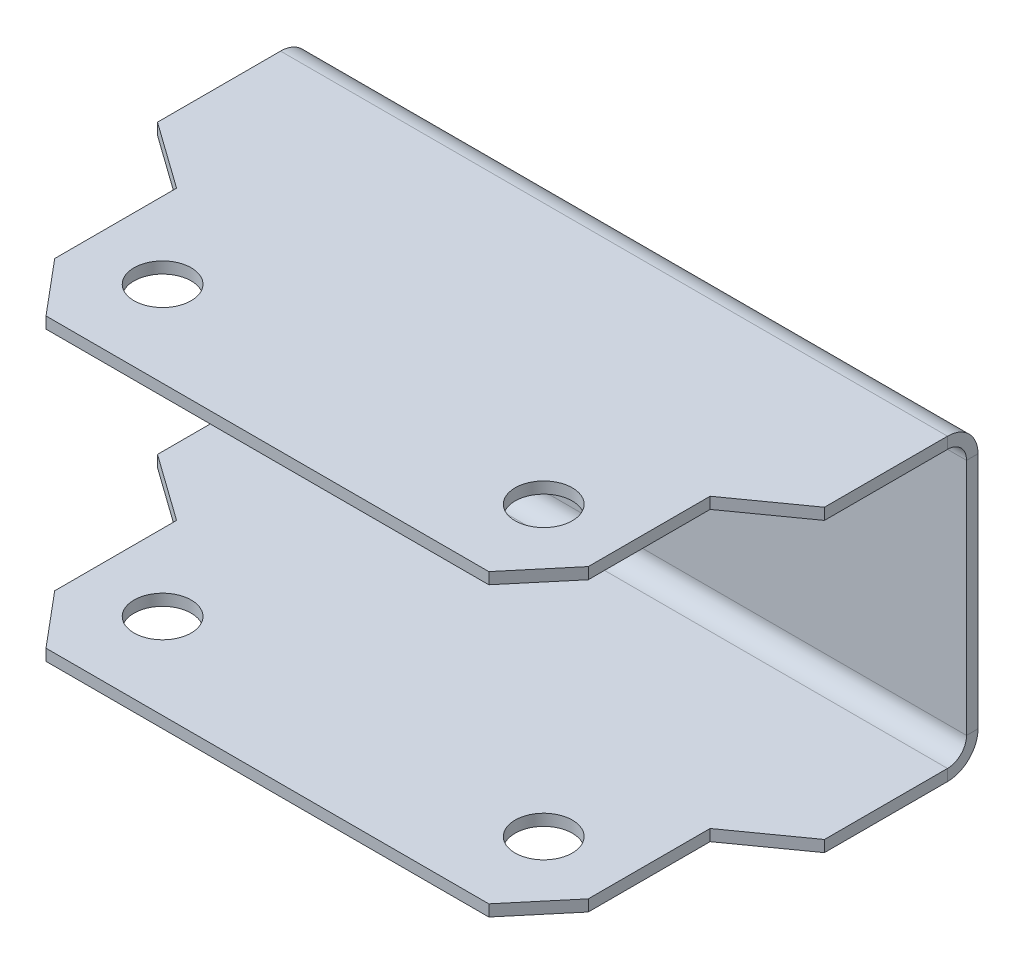
ISO-10303-21;
HEADER;
FILE_DESCRIPTION(('STEP AP214'),'2;1');
FILE_NAME('part.step','',(''),(''),'','','');
FILE_SCHEMA(('AUTOMOTIVE_DESIGN { 1 0 10303 214 1 1 1 1 }'));
ENDSEC;
DATA;
#1=APPLICATION_CONTEXT('core data for automotive mechanical design processes');
#2=APPLICATION_PROTOCOL_DEFINITION('international standard','automotive_design',2000,#1);
#3=PRODUCT_CONTEXT('',#1,'mechanical');
#4=PRODUCT('Part','Part','',(#3));
#5=PRODUCT_RELATED_PRODUCT_CATEGORY('part','',(#4));
#6=PRODUCT_DEFINITION_FORMATION('','',#4);
#7=PRODUCT_DEFINITION_CONTEXT('part definition',#1,'design');
#8=PRODUCT_DEFINITION('design','',#6,#7);
#9=PRODUCT_DEFINITION_SHAPE('','',#8);
#10=(LENGTH_UNIT() NAMED_UNIT(*) SI_UNIT(.MILLI.,.METRE.));
#11=(NAMED_UNIT(*) PLANE_ANGLE_UNIT() SI_UNIT($,.RADIAN.));
#12=(NAMED_UNIT(*) SI_UNIT($,.STERADIAN.) SOLID_ANGLE_UNIT());
#13=UNCERTAINTY_MEASURE_WITH_UNIT(LENGTH_MEASURE(1.E-05),#10,'distance_accuracy_value','');
#14=(GEOMETRIC_REPRESENTATION_CONTEXT(3) GLOBAL_UNCERTAINTY_ASSIGNED_CONTEXT((#13)) GLOBAL_UNIT_ASSIGNED_CONTEXT((#10,
#11,#12)) REPRESENTATION_CONTEXT('',''));
#15=CARTESIAN_POINT('',(0.,0.,0.));
#16=DIRECTION('',(0.,0.,1.));
#17=DIRECTION('',(1.,0.,0.));
#18=AXIS2_PLACEMENT_3D('',#15,#16,#17);
#19=CARTESIAN_POINT('',(0.,0.,-1.2));
#20=DIRECTION('',(0.,0.,1.));
#21=DIRECTION('',(1.,0.,0.));
#22=AXIS2_PLACEMENT_3D('',#19,#20,#21);
#23=PLANE('',#22);
#24=DIRECTION('',(0.,1.,0.));
#25=VECTOR('',#24,1.);
#26=CARTESIAN_POINT('',(35.,-29.5,-1.2));
#27=LINE('',#26,#25);
#28=CARTESIAN_POINT('',(35.,-12.5,-1.2));
#29=VERTEX_POINT('',#28);
#30=CARTESIAN_POINT('',(35.,12.5,-1.2));
#31=VERTEX_POINT('',#30);
#32=EDGE_CURVE('E48',#29,#31,#27,.T.);
#33=ORIENTED_EDGE('',*,*,#32,.F.);
#34=DIRECTION('',(-1.,0.,0.));
#35=VECTOR('',#34,1.);
#36=CARTESIAN_POINT('',(0.,-12.5,-1.2));
#37=LINE('',#36,#35);
#38=CARTESIAN_POINT('',(-35.,-12.5,-1.2));
#39=VERTEX_POINT('',#38);
#40=EDGE_CURVE('E370',#29,#39,#37,.T.);
#41=ORIENTED_EDGE('',*,*,#40,.T.);
#42=DIRECTION('',(0.,-1.,0.));
#43=VECTOR('',#42,1.);
#44=CARTESIAN_POINT('',(-35.,-29.5,-1.2));
#45=LINE('',#44,#43);
#46=CARTESIAN_POINT('',(-35.,12.5,-1.2));
#47=VERTEX_POINT('',#46);
#48=EDGE_CURVE('E378',#47,#39,#45,.T.);
#49=ORIENTED_EDGE('',*,*,#48,.F.);
#50=DIRECTION('',(-1.,0.,0.));
#51=VECTOR('',#50,1.);
#52=CARTESIAN_POINT('',(0.,12.5,-1.2));
#53=LINE('',#52,#51);
#54=EDGE_CURVE('E361',#31,#47,#53,.T.);
#55=ORIENTED_EDGE('',*,*,#54,.F.);
#56=EDGE_LOOP('',(#33,#41,#49,#55));
#57=FACE_BOUND('',#56,.T.);
#58=ADVANCED_FACE('F44',(#57),#23,.F.);
#59=CARTESIAN_POINT('',(0.,0.,0.));
#60=DIRECTION('',(0.,0.,1.));
#61=DIRECTION('',(1.,0.,0.));
#62=AXIS2_PLACEMENT_3D('',#59,#60,#61);
#63=PLANE('',#62);
#64=DIRECTION('',(-1.,0.,0.));
#65=VECTOR('',#64,1.);
#66=CARTESIAN_POINT('',(0.,-12.5,0.));
#67=LINE('',#66,#65);
#68=CARTESIAN_POINT('',(35.,-12.5,0.));
#69=VERTEX_POINT('',#68);
#70=CARTESIAN_POINT('',(-35.,-12.5,0.));
#71=VERTEX_POINT('',#70);
#72=EDGE_CURVE('E53',#69,#71,#67,.T.);
#73=ORIENTED_EDGE('',*,*,#72,.F.);
#74=DIRECTION('',(0.,1.,0.));
#75=VECTOR('',#74,1.);
#76=CARTESIAN_POINT('',(35.,-29.5,0.));
#77=LINE('',#76,#75);
#78=CARTESIAN_POINT('',(35.,12.5,0.));
#79=VERTEX_POINT('',#78);
#80=EDGE_CURVE('E69',#69,#79,#77,.T.);
#81=ORIENTED_EDGE('',*,*,#80,.T.);
#82=DIRECTION('',(-1.,0.,0.));
#83=VECTOR('',#82,1.);
#84=CARTESIAN_POINT('',(0.,12.5,0.));
#85=LINE('',#84,#83);
#86=CARTESIAN_POINT('',(-35.,12.5,0.));
#87=VERTEX_POINT('',#86);
#88=EDGE_CURVE('E366',#79,#87,#85,.T.);
#89=ORIENTED_EDGE('',*,*,#88,.T.);
#90=DIRECTION('',(0.,-1.,0.));
#91=VECTOR('',#90,1.);
#92=CARTESIAN_POINT('',(-35.,-29.5,0.));
#93=LINE('',#92,#91);
#94=EDGE_CURVE('E61',#87,#71,#93,.T.);
#95=ORIENTED_EDGE('',*,*,#94,.T.);
#96=EDGE_LOOP('',(#73,#81,#89,#95));
#97=FACE_BOUND('',#96,.T.);
#98=ADVANCED_FACE('F380',(#97),#63,.T.);
#99=CARTESIAN_POINT('',(-35.,-29.5,-1.2));
#100=DIRECTION('',(-1.,0.,0.));
#101=DIRECTION('',(0.,0.,1.));
#102=AXIS2_PLACEMENT_3D('',#99,#100,#101);
#103=PLANE('',#102);
#104=DIRECTION('',(0.,0.,-1.));
#105=VECTOR('',#104,1.);
#106=CARTESIAN_POINT('',(-35.,-12.5,-1.19999999999988));
#107=LINE('',#106,#105);
#108=EDGE_CURVE('E12',#71,#39,#107,.T.);
#109=ORIENTED_EDGE('',*,*,#108,.F.);
#110=ORIENTED_EDGE('',*,*,#94,.F.);
#111=DIRECTION('',(0.,0.,-1.));
#112=VECTOR('',#111,1.);
#113=CARTESIAN_POINT('',(-35.,12.5,-1.19999999999971));
#114=LINE('',#113,#112);
#115=EDGE_CURVE('E363',#87,#47,#114,.T.);
#116=ORIENTED_EDGE('',*,*,#115,.T.);
#117=ORIENTED_EDGE('',*,*,#48,.T.);
#118=EDGE_LOOP('',(#109,#110,#116,#117));
#119=FACE_BOUND('',#118,.T.);
#120=ADVANCED_FACE('F46',(#119),#103,.T.);
#121=CARTESIAN_POINT('',(35.,-29.5,-1.2));
#122=DIRECTION('',(1.,0.,0.));
#123=DIRECTION('',(0.,0.,-1.));
#124=AXIS2_PLACEMENT_3D('',#121,#122,#123);
#125=PLANE('',#124);
#126=DIRECTION('',(0.,0.,1.));
#127=VECTOR('',#126,1.);
#128=CARTESIAN_POINT('',(35.,-12.5,-1.19999999999988));
#129=LINE('',#128,#127);
#130=EDGE_CURVE('E373',#29,#69,#129,.T.);
#131=ORIENTED_EDGE('',*,*,#130,.F.);
#132=ORIENTED_EDGE('',*,*,#32,.T.);
#133=DIRECTION('',(0.,0.,1.));
#134=VECTOR('',#133,1.);
#135=CARTESIAN_POINT('',(35.,12.5,-1.19999999999971));
#136=LINE('',#135,#134);
#137=EDGE_CURVE('E368',#31,#79,#136,.T.);
#138=ORIENTED_EDGE('',*,*,#137,.T.);
#139=ORIENTED_EDGE('',*,*,#80,.F.);
#140=EDGE_LOOP('',(#131,#132,#138,#139));
#141=FACE_BOUND('',#140,.T.);
#142=ADVANCED_FACE('F383',(#141),#125,.T.);
#143=CARTESIAN_POINT('',(35.,12.5,2.));
#144=DIRECTION('',(1.,0.,0.));
#145=DIRECTION('',(0.,0.,-1.));
#146=AXIS2_PLACEMENT_3D('',#143,#144,#145);
#147=PLANE('',#146);
#148=DIRECTION('',(0.,-1.,0.));
#149=VECTOR('',#148,1.);
#150=CARTESIAN_POINT('',(35.,15.6999999999997,2.00000000000001));
#151=LINE('',#150,#149);
#152=CARTESIAN_POINT('',(35.,15.7,2.00000000000002));
#153=VERTEX_POINT('',#152);
#154=CARTESIAN_POINT('',(35.,14.5,2.));
#155=VERTEX_POINT('',#154);
#156=EDGE_CURVE('E255',#153,#155,#151,.T.);
#157=ORIENTED_EDGE('',*,*,#156,.T.);
#158=CARTESIAN_POINT('',(35.,12.5,2.));
#159=DIRECTION('',(1.,0.,0.));
#160=DIRECTION('',(0.,0.,-1.));
#161=AXIS2_PLACEMENT_3D('',#158,#159,#160);
#162=CIRCLE('',#161,2.);
#163=EDGE_CURVE('E263',#155,#79,#162,.F.);
#164=ORIENTED_EDGE('',*,*,#163,.T.);
#165=ORIENTED_EDGE('',*,*,#137,.F.);
#166=CARTESIAN_POINT('',(35.,12.5,2.));
#167=DIRECTION('',(-1.,0.,0.));
#168=DIRECTION('',(0.,0.,-1.));
#169=AXIS2_PLACEMENT_3D('',#166,#167,#168);
#170=CIRCLE('',#169,3.2);
#171=EDGE_CURVE('E351',#153,#31,#170,.T.);
#172=ORIENTED_EDGE('',*,*,#171,.F.);
#173=EDGE_LOOP('',(#157,#164,#165,#172));
#174=FACE_BOUND('',#173,.T.);
#175=ADVANCED_FACE('F387',(#174),#147,.T.);
#176=CARTESIAN_POINT('',(-35.,12.5,2.));
#177=DIRECTION('',(-1.,0.,0.));
#178=DIRECTION('',(0.,0.,1.));
#179=AXIS2_PLACEMENT_3D('',#176,#177,#178);
#180=PLANE('',#179);
#181=CARTESIAN_POINT('',(-35.,12.5,2.));
#182=DIRECTION('',(1.,0.,0.));
#183=DIRECTION('',(0.,0.,-1.));
#184=AXIS2_PLACEMENT_3D('',#181,#182,#183);
#185=CIRCLE('',#184,2.);
#186=CARTESIAN_POINT('',(-35.,14.5,2.));
#187=VERTEX_POINT('',#186);
#188=EDGE_CURVE('E355',#87,#187,#185,.T.);
#189=ORIENTED_EDGE('',*,*,#188,.T.);
#190=DIRECTION('',(0.,1.,0.));
#191=VECTOR('',#190,1.);
#192=CARTESIAN_POINT('',(-35.,15.6999999999997,2.00000000000001));
#193=LINE('',#192,#191);
#194=CARTESIAN_POINT('',(-35.,15.7,2.00000000000001));
#195=VERTEX_POINT('',#194);
#196=EDGE_CURVE('E343',#187,#195,#193,.T.);
#197=ORIENTED_EDGE('',*,*,#196,.T.);
#198=CARTESIAN_POINT('',(-35.,12.5,2.));
#199=DIRECTION('',(1.,0.,0.));
#200=DIRECTION('',(0.,0.,1.));
#201=AXIS2_PLACEMENT_3D('',#198,#199,#200);
#202=CIRCLE('',#201,3.2);
#203=EDGE_CURVE('E354',#47,#195,#202,.T.);
#204=ORIENTED_EDGE('',*,*,#203,.F.);
#205=ORIENTED_EDGE('',*,*,#115,.F.);
#206=EDGE_LOOP('',(#189,#197,#204,#205));
#207=FACE_BOUND('',#206,.T.);
#208=ADVANCED_FACE('F404',(#207),#180,.T.);
#209=CARTESIAN_POINT('',(-70.1293065090326,12.5,2.));
#210=DIRECTION('',(1.,0.,0.));
#211=DIRECTION('',(0.,0.,-1.));
#212=AXIS2_PLACEMENT_3D('',#209,#210,#211);
#213=CYLINDRICAL_SURFACE('',#212,3.2);
#214=ORIENTED_EDGE('',*,*,#54,.T.);
#215=ORIENTED_EDGE('',*,*,#203,.T.);
#216=DIRECTION('',(-1.,0.,0.));
#217=VECTOR('',#216,1.);
#218=CARTESIAN_POINT('',(0.,15.7,2.00000000000001));
#219=LINE('',#218,#217);
#220=EDGE_CURVE('E294',#153,#195,#219,.T.);
#221=ORIENTED_EDGE('',*,*,#220,.F.);
#222=ORIENTED_EDGE('',*,*,#171,.T.);
#223=EDGE_LOOP('',(#214,#215,#221,#222));
#224=FACE_BOUND('',#223,.T.);
#225=ADVANCED_FACE('F391',(#224),#213,.T.);
#226=CARTESIAN_POINT('',(-70.1293065090326,12.5,2.));
#227=DIRECTION('',(1.,0.,0.));
#228=DIRECTION('',(0.,0.,-1.));
#229=AXIS2_PLACEMENT_3D('',#226,#227,#228);
#230=CYLINDRICAL_SURFACE('',#229,2.);
#231=ORIENTED_EDGE('',*,*,#88,.F.);
#232=ORIENTED_EDGE('',*,*,#163,.F.);
#233=DIRECTION('',(-1.,0.,0.));
#234=VECTOR('',#233,1.);
#235=CARTESIAN_POINT('',(0.,14.5,2.));
#236=LINE('',#235,#234);
#237=EDGE_CURVE('E346',#155,#187,#236,.T.);
#238=ORIENTED_EDGE('',*,*,#237,.T.);
#239=ORIENTED_EDGE('',*,*,#188,.F.);
#240=EDGE_LOOP('',(#231,#232,#238,#239));
#241=FACE_BOUND('',#240,.T.);
#242=ADVANCED_FACE('F408',(#241),#230,.F.);
#243=CARTESIAN_POINT('',(35.,15.7,14.9159295503333));
#244=DIRECTION('',(0.581116537312831,0.,0.813820354907362));
#245=DIRECTION('',(-0.813820354907363,0.,0.581116537312831));
#246=AXIS2_PLACEMENT_3D('',#243,#244,#245);
#247=PLANE('',#246);
#248=DIRECTION('',(-0.813820354907362,0.,0.581116537312831));
#249=VECTOR('',#248,1.);
#250=CARTESIAN_POINT('',(35.,14.5,14.9159295503333));
#251=LINE('',#250,#249);
#252=CARTESIAN_POINT('',(35.,14.5,14.9159295503333));
#253=VERTEX_POINT('',#252);
#254=CARTESIAN_POINT('',(28.,14.5,19.9143493326117));
#255=VERTEX_POINT('',#254);
#256=EDGE_CURVE('E286',#253,#255,#251,.T.);
#257=ORIENTED_EDGE('',*,*,#256,.F.);
#258=DIRECTION('',(0.,-1.,0.));
#259=VECTOR('',#258,1.);
#260=CARTESIAN_POINT('',(35.,15.7,14.9159295503333));
#261=LINE('',#260,#259);
#262=CARTESIAN_POINT('',(35.,15.7,14.9159295503333));
#263=VERTEX_POINT('',#262);
#264=EDGE_CURVE('E260',#263,#253,#261,.T.);
#265=ORIENTED_EDGE('',*,*,#264,.F.);
#266=DIRECTION('',(-0.813820354907362,0.,0.581116537312831));
#267=VECTOR('',#266,1.);
#268=CARTESIAN_POINT('',(35.,15.7,14.9159295503333));
#269=LINE('',#268,#267);
#270=CARTESIAN_POINT('',(28.,15.6999999999999,19.9143493326117));
#271=VERTEX_POINT('',#270);
#272=EDGE_CURVE('E340',#263,#271,#269,.T.);
#273=ORIENTED_EDGE('',*,*,#272,.T.);
#274=DIRECTION('',(0.,-1.,0.));
#275=VECTOR('',#274,1.);
#276=CARTESIAN_POINT('',(28.,15.6999999999999,19.9143493326117));
#277=LINE('',#276,#275);
#278=EDGE_CURVE('E338',#271,#255,#277,.T.);
#279=ORIENTED_EDGE('',*,*,#278,.T.);
#280=EDGE_LOOP('',(#257,#265,#273,#279));
#281=FACE_BOUND('',#280,.T.);
#282=ADVANCED_FACE('F488',(#281),#247,.T.);
#283=CARTESIAN_POINT('',(28.,15.6999999999999,19.9143493326117));
#284=DIRECTION('',(1.,0.,0.));
#285=DIRECTION('',(0.,1.,0.));
#286=AXIS2_PLACEMENT_3D('',#283,#284,#285);
#287=PLANE('',#286);
#288=DIRECTION('',(0.,0.,1.));
#289=VECTOR('',#288,1.);
#290=CARTESIAN_POINT('',(28.,14.5,19.9143493326117));
#291=LINE('',#290,#289);
#292=CARTESIAN_POINT('',(28.,14.4999999999999,32.7050010724791));
#293=VERTEX_POINT('',#292);
#294=EDGE_CURVE('E283',#255,#293,#291,.T.);
#295=ORIENTED_EDGE('',*,*,#294,.F.);
#296=ORIENTED_EDGE('',*,*,#278,.F.);
#297=DIRECTION('',(0.,0.,1.));
#298=VECTOR('',#297,1.);
#299=CARTESIAN_POINT('',(28.,15.6999999999999,19.9143493326117));
#300=LINE('',#299,#298);
#301=CARTESIAN_POINT('',(28.,15.6999999999999,32.7050010724791));
#302=VERTEX_POINT('',#301);
#303=EDGE_CURVE('E335',#271,#302,#300,.T.);
#304=ORIENTED_EDGE('',*,*,#303,.T.);
#305=DIRECTION('',(0.,-1.,0.));
#306=VECTOR('',#305,1.);
#307=CARTESIAN_POINT('',(28.,15.6999999999999,32.7050010724791));
#308=LINE('',#307,#306);
#309=EDGE_CURVE('E333',#302,#293,#308,.T.);
#310=ORIENTED_EDGE('',*,*,#309,.T.);
#311=EDGE_LOOP('',(#295,#296,#304,#310));
#312=FACE_BOUND('',#311,.T.);
#313=ADVANCED_FACE('F497',(#312),#287,.T.);
#314=CARTESIAN_POINT('',(28.,15.6999999999999,32.7050010724791));
#315=DIRECTION('',(0.766044443118979,0.,0.642787609686538));
#316=DIRECTION('',(-0.642787609686538,0.,0.766044443118979));
#317=AXIS2_PLACEMENT_3D('',#314,#315,#316);
#318=PLANE('',#317);
#319=DIRECTION('',(-0.642787609686538,0.,0.766044443118979));
#320=VECTOR('',#319,1.);
#321=CARTESIAN_POINT('',(28.,14.4999999999999,32.7050010724791));
#322=LINE('',#321,#320);
#323=CARTESIAN_POINT('',(23.238290905672,14.4999999999999,38.3797849925331));
#324=VERTEX_POINT('',#323);
#325=EDGE_CURVE('E280',#293,#324,#322,.T.);
#326=ORIENTED_EDGE('',*,*,#325,.F.);
#327=ORIENTED_EDGE('',*,*,#309,.F.);
#328=DIRECTION('',(-0.642787609686538,0.,0.766044443118979));
#329=VECTOR('',#328,1.);
#330=CARTESIAN_POINT('',(28.,15.6999999999999,32.7050010724791));
#331=LINE('',#330,#329);
#332=CARTESIAN_POINT('',(23.238290905672,15.6999999999999,38.3797849925331));
#333=VERTEX_POINT('',#332);
#334=EDGE_CURVE('E330',#302,#333,#331,.T.);
#335=ORIENTED_EDGE('',*,*,#334,.T.);
#336=DIRECTION('',(0.,-1.,0.));
#337=VECTOR('',#336,1.);
#338=CARTESIAN_POINT('',(23.238290905672,15.6999999999999,38.3797849925331));
#339=LINE('',#338,#337);
#340=EDGE_CURVE('E328',#333,#324,#339,.T.);
#341=ORIENTED_EDGE('',*,*,#340,.T.);
#342=EDGE_LOOP('',(#326,#327,#335,#341));
#343=FACE_BOUND('',#342,.T.);
#344=ADVANCED_FACE('F507',(#343),#318,.T.);
#345=CARTESIAN_POINT('',(23.238290905672,15.6999999999999,38.3797849925331));
#346=DIRECTION('',(0.,0.,1.));
#347=DIRECTION('',(-1.,0.,0.));
#348=AXIS2_PLACEMENT_3D('',#345,#346,#347);
#349=PLANE('',#348);
#350=DIRECTION('',(-1.,0.,0.));
#351=VECTOR('',#350,1.);
#352=CARTESIAN_POINT('',(23.238290905672,14.4999999999999,38.3797849925331));
#353=LINE('',#352,#351);
#354=CARTESIAN_POINT('',(-23.238290905672,14.4999999999999,38.3797849925331));
#355=VERTEX_POINT('',#354);
#356=EDGE_CURVE('E277',#324,#355,#353,.T.);
#357=ORIENTED_EDGE('',*,*,#356,.F.);
#358=ORIENTED_EDGE('',*,*,#340,.F.);
#359=DIRECTION('',(-1.,0.,0.));
#360=VECTOR('',#359,1.);
#361=CARTESIAN_POINT('',(23.238290905672,15.6999999999999,38.3797849925331));
#362=LINE('',#361,#360);
#363=CARTESIAN_POINT('',(-23.238290905672,15.6999999999999,38.3797849925331));
#364=VERTEX_POINT('',#363);
#365=EDGE_CURVE('E325',#333,#364,#362,.T.);
#366=ORIENTED_EDGE('',*,*,#365,.T.);
#367=DIRECTION('',(0.,-1.,0.));
#368=VECTOR('',#367,1.);
#369=CARTESIAN_POINT('',(-23.238290905672,15.6999999999999,38.3797849925331));
#370=LINE('',#369,#368);
#371=EDGE_CURVE('E323',#364,#355,#370,.T.);
#372=ORIENTED_EDGE('',*,*,#371,.T.);
#373=EDGE_LOOP('',(#357,#358,#366,#372));
#374=FACE_BOUND('',#373,.T.);
#375=ADVANCED_FACE('F517',(#374),#349,.T.);
#376=CARTESIAN_POINT('',(-28.,15.6999999999999,32.7050010724791));
#377=DIRECTION('',(-0.766044443118979,0.,0.642787609686538));
#378=DIRECTION('',(-0.642787609686538,0.,-0.766044443118979));
#379=AXIS2_PLACEMENT_3D('',#376,#377,#378);
#380=PLANE('',#379);
#381=DIRECTION('',(-0.642787609686538,0.,-0.766044443118979));
#382=VECTOR('',#381,1.);
#383=CARTESIAN_POINT('',(-28.,14.4999999999999,32.7050010724791));
#384=LINE('',#383,#382);
#385=CARTESIAN_POINT('',(-28.,14.4999999999999,32.7050010724791));
#386=VERTEX_POINT('',#385);
#387=EDGE_CURVE('E274',#355,#386,#384,.T.);
#388=ORIENTED_EDGE('',*,*,#387,.F.);
#389=ORIENTED_EDGE('',*,*,#371,.F.);
#390=DIRECTION('',(-0.642787609686538,0.,-0.766044443118979));
#391=VECTOR('',#390,1.);
#392=CARTESIAN_POINT('',(-28.,15.6999999999999,32.7050010724791));
#393=LINE('',#392,#391);
#394=CARTESIAN_POINT('',(-28.,15.6999999999999,32.7050010724791));
#395=VERTEX_POINT('',#394);
#396=EDGE_CURVE('E320',#364,#395,#393,.T.);
#397=ORIENTED_EDGE('',*,*,#396,.T.);
#398=DIRECTION('',(0.,-1.,0.));
#399=VECTOR('',#398,1.);
#400=CARTESIAN_POINT('',(-28.,15.6999999999999,32.7050010724791));
#401=LINE('',#400,#399);
#402=EDGE_CURVE('E318',#395,#386,#401,.T.);
#403=ORIENTED_EDGE('',*,*,#402,.T.);
#404=EDGE_LOOP('',(#388,#389,#397,#403));
#405=FACE_BOUND('',#404,.T.);
#406=ADVANCED_FACE('F527',(#405),#380,.T.);
#407=CARTESIAN_POINT('',(-28.,15.6999999999999,19.9143493326117));
#408=DIRECTION('',(-1.,0.,0.));
#409=DIRECTION('',(0.,-1.,0.));
#410=AXIS2_PLACEMENT_3D('',#407,#408,#409);
#411=PLANE('',#410);
#412=DIRECTION('',(0.,0.,-1.));
#413=VECTOR('',#412,1.);
#414=CARTESIAN_POINT('',(-28.,14.5,19.9143493326117));
#415=LINE('',#414,#413);
#416=CARTESIAN_POINT('',(-28.,14.5,19.9143493326117));
#417=VERTEX_POINT('',#416);
#418=EDGE_CURVE('E271',#386,#417,#415,.T.);
#419=ORIENTED_EDGE('',*,*,#418,.F.);
#420=ORIENTED_EDGE('',*,*,#402,.F.);
#421=DIRECTION('',(0.,0.,-1.));
#422=VECTOR('',#421,1.);
#423=CARTESIAN_POINT('',(-28.,15.6999999999999,19.9143493326117));
#424=LINE('',#423,#422);
#425=CARTESIAN_POINT('',(-28.,15.6999999999999,19.9143493326117));
#426=VERTEX_POINT('',#425);
#427=EDGE_CURVE('E315',#395,#426,#424,.T.);
#428=ORIENTED_EDGE('',*,*,#427,.T.);
#429=DIRECTION('',(0.,-1.,0.));
#430=VECTOR('',#429,1.);
#431=CARTESIAN_POINT('',(-28.,15.6999999999999,19.9143493326117));
#432=LINE('',#431,#430);
#433=EDGE_CURVE('E313',#426,#417,#432,.T.);
#434=ORIENTED_EDGE('',*,*,#433,.T.);
#435=EDGE_LOOP('',(#419,#420,#428,#434));
#436=FACE_BOUND('',#435,.T.);
#437=ADVANCED_FACE('F537',(#436),#411,.T.);
#438=CARTESIAN_POINT('',(-35.,15.7,14.9159295503333));
#439=DIRECTION('',(-0.58111653731283,0.,0.813820354907363));
#440=DIRECTION('',(-0.813820354907363,0.,-0.58111653731283));
#441=AXIS2_PLACEMENT_3D('',#438,#439,#440);
#442=PLANE('',#441);
#443=DIRECTION('',(-0.813820354907363,0.,-0.58111653731283));
#444=VECTOR('',#443,1.);
#445=CARTESIAN_POINT('',(-35.,14.5,14.9159295503333));
#446=LINE('',#445,#444);
#447=CARTESIAN_POINT('',(-35.,14.5,14.9159295503333));
#448=VERTEX_POINT('',#447);
#449=EDGE_CURVE('E268',#417,#448,#446,.T.);
#450=ORIENTED_EDGE('',*,*,#449,.F.);
#451=ORIENTED_EDGE('',*,*,#433,.F.);
#452=DIRECTION('',(-0.813820354907363,0.,-0.58111653731283));
#453=VECTOR('',#452,1.);
#454=CARTESIAN_POINT('',(-35.,15.7,14.9159295503333));
#455=LINE('',#454,#453);
#456=CARTESIAN_POINT('',(-35.,15.7,14.9159295503333));
#457=VERTEX_POINT('',#456);
#458=EDGE_CURVE('E310',#426,#457,#455,.T.);
#459=ORIENTED_EDGE('',*,*,#458,.T.);
#460=DIRECTION('',(0.,-1.,0.));
#461=VECTOR('',#460,1.);
#462=CARTESIAN_POINT('',(-35.,15.7,14.9159295503333));
#463=LINE('',#462,#461);
#464=EDGE_CURVE('E308',#457,#448,#463,.T.);
#465=ORIENTED_EDGE('',*,*,#464,.T.);
#466=EDGE_LOOP('',(#450,#451,#459,#465));
#467=FACE_BOUND('',#466,.T.);
#468=ADVANCED_FACE('F547',(#467),#442,.T.);
#469=CARTESIAN_POINT('',(-20.,15.6999999999999,29.3797849925331));
#470=DIRECTION('',(0.,-1.,0.));
#471=DIRECTION('',(1.,0.,0.));
#472=AXIS2_PLACEMENT_3D('',#469,#470,#471);
#473=CYLINDRICAL_SURFACE('',#472,3.);
#474=CARTESIAN_POINT('',(-20.,15.6999999999999,29.3797849925331));
#475=DIRECTION('',(0.,-1.,0.));
#476=DIRECTION('',(1.,0.,0.));
#477=AXIS2_PLACEMENT_3D('',#474,#475,#476);
#478=CIRCLE('',#477,3.);
#479=CARTESIAN_POINT('',(-17.,15.6999999999999,29.3797849925331));
#480=VERTEX_POINT('',#479);
#481=EDGE_CURVE('E296',#480,#480,#478,.T.);
#482=ORIENTED_EDGE('',*,*,#481,.F.);
#483=EDGE_LOOP('',(#482));
#484=FACE_BOUND('',#483,.T.);
#485=CARTESIAN_POINT('',(-20.,14.4999999999999,29.3797849925331));
#486=DIRECTION('',(0.,-1.,0.));
#487=DIRECTION('',(1.,0.,0.));
#488=AXIS2_PLACEMENT_3D('',#485,#486,#487);
#489=CIRCLE('',#488,3.);
#490=CARTESIAN_POINT('',(-17.,14.4999999999999,29.3797849925331));
#491=VERTEX_POINT('',#490);
#492=EDGE_CURVE('E305',#491,#491,#489,.T.);
#493=ORIENTED_EDGE('',*,*,#492,.T.);
#494=EDGE_LOOP('',(#493));
#495=FACE_BOUND('',#494,.T.);
#496=ADVANCED_FACE('F557',(#484,#495),#473,.F.);
#497=CARTESIAN_POINT('',(20.,15.6999999999999,29.3797849925331));
#498=DIRECTION('',(0.,-1.,0.));
#499=DIRECTION('',(1.,0.,0.));
#500=AXIS2_PLACEMENT_3D('',#497,#498,#499);
#501=CYLINDRICAL_SURFACE('',#500,3.);
#502=CARTESIAN_POINT('',(20.,15.6999999999999,29.3797849925331));
#503=DIRECTION('',(0.,-1.,0.));
#504=DIRECTION('',(-1.,0.,0.));
#505=AXIS2_PLACEMENT_3D('',#502,#503,#504);
#506=CIRCLE('',#505,3.);
#507=CARTESIAN_POINT('',(17.,15.6999999999999,29.3797849925331));
#508=VERTEX_POINT('',#507);
#509=EDGE_CURVE('E299',#508,#508,#506,.T.);
#510=ORIENTED_EDGE('',*,*,#509,.F.);
#511=EDGE_LOOP('',(#510));
#512=FACE_BOUND('',#511,.T.);
#513=CARTESIAN_POINT('',(20.,14.4999999999999,29.3797849925331));
#514=DIRECTION('',(0.,-1.,0.));
#515=DIRECTION('',(-1.,0.,0.));
#516=AXIS2_PLACEMENT_3D('',#513,#514,#515);
#517=CIRCLE('',#516,3.);
#518=CARTESIAN_POINT('',(17.,14.4999999999999,29.3797849925331));
#519=VERTEX_POINT('',#518);
#520=EDGE_CURVE('E302',#519,#519,#517,.T.);
#521=ORIENTED_EDGE('',*,*,#520,.T.);
#522=EDGE_LOOP('',(#521));
#523=FACE_BOUND('',#522,.T.);
#524=ADVANCED_FACE('F567',(#512,#523),#501,.F.);
#525=CARTESIAN_POINT('',(0.,15.7000000000001,-14.5840704496667));
#526=DIRECTION('',(0.,-1.,0.));
#527=DIRECTION('',(1.,0.,0.));
#528=AXIS2_PLACEMENT_3D('',#525,#526,#527);
#529=PLANE('',#528);
#530=ORIENTED_EDGE('',*,*,#509,.T.);
#531=EDGE_LOOP('',(#530));
#532=FACE_BOUND('',#531,.T.);
#533=ORIENTED_EDGE('',*,*,#481,.T.);
#534=EDGE_LOOP('',(#533));
#535=FACE_BOUND('',#534,.T.);
#536=DIRECTION('',(0.,0.,1.));
#537=VECTOR('',#536,1.);
#538=CARTESIAN_POINT('',(35.,15.7000000000002,-44.0840704496667));
#539=LINE('',#538,#537);
#540=EDGE_CURVE('E264',#153,#263,#539,.T.);
#541=ORIENTED_EDGE('',*,*,#540,.F.);
#542=ORIENTED_EDGE('',*,*,#220,.T.);
#543=DIRECTION('',(0.,0.,-1.));
#544=VECTOR('',#543,1.);
#545=CARTESIAN_POINT('',(-35.,15.7000000000002,-44.0840704496667));
#546=LINE('',#545,#544);
#547=EDGE_CURVE('E291',#457,#195,#546,.T.);
#548=ORIENTED_EDGE('',*,*,#547,.F.);
#549=ORIENTED_EDGE('',*,*,#458,.F.);
#550=ORIENTED_EDGE('',*,*,#427,.F.);
#551=ORIENTED_EDGE('',*,*,#396,.F.);
#552=ORIENTED_EDGE('',*,*,#365,.F.);
#553=ORIENTED_EDGE('',*,*,#334,.F.);
#554=ORIENTED_EDGE('',*,*,#303,.F.);
#555=ORIENTED_EDGE('',*,*,#272,.F.);
#556=EDGE_LOOP('',(#541,#542,#548,#549,#550,#551,#552,#553,#554,#555));
#557=FACE_BOUND('',#556,.T.);
#558=ADVANCED_FACE('F396',(#532,#535,#557),#529,.F.);
#559=CARTESIAN_POINT('',(-35.,15.7000000000002,-44.0840704496667));
#560=DIRECTION('',(-1.,0.,0.));
#561=DIRECTION('',(0.,-1.,0.));
#562=AXIS2_PLACEMENT_3D('',#559,#560,#561);
#563=PLANE('',#562);
#564=ORIENTED_EDGE('',*,*,#196,.F.);
#565=DIRECTION('',(0.,0.,-1.));
#566=VECTOR('',#565,1.);
#567=CARTESIAN_POINT('',(-35.,14.5000000000002,-44.0840704496667));
#568=LINE('',#567,#566);
#569=EDGE_CURVE('E266',#448,#187,#568,.T.);
#570=ORIENTED_EDGE('',*,*,#569,.F.);
#571=ORIENTED_EDGE('',*,*,#464,.F.);
#572=ORIENTED_EDGE('',*,*,#547,.T.);
#573=EDGE_LOOP('',(#564,#570,#571,#572));
#574=FACE_BOUND('',#573,.T.);
#575=ADVANCED_FACE('F401',(#574),#563,.T.);
#576=CARTESIAN_POINT('',(0.,14.5000000000001,-14.5840704496667));
#577=DIRECTION('',(0.,-1.,0.));
#578=DIRECTION('',(1.,0.,0.));
#579=AXIS2_PLACEMENT_3D('',#576,#577,#578);
#580=PLANE('',#579);
#581=ORIENTED_EDGE('',*,*,#237,.F.);
#582=DIRECTION('',(0.,0.,1.));
#583=VECTOR('',#582,1.);
#584=CARTESIAN_POINT('',(35.,14.5000000000002,-44.0840704496667));
#585=LINE('',#584,#583);
#586=EDGE_CURVE('E289',#155,#253,#585,.T.);
#587=ORIENTED_EDGE('',*,*,#586,.T.);
#588=ORIENTED_EDGE('',*,*,#256,.T.);
#589=ORIENTED_EDGE('',*,*,#294,.T.);
#590=ORIENTED_EDGE('',*,*,#325,.T.);
#591=ORIENTED_EDGE('',*,*,#356,.T.);
#592=ORIENTED_EDGE('',*,*,#387,.T.);
#593=ORIENTED_EDGE('',*,*,#418,.T.);
#594=ORIENTED_EDGE('',*,*,#449,.T.);
#595=ORIENTED_EDGE('',*,*,#569,.T.);
#596=EDGE_LOOP('',(#581,#587,#588,#589,#590,#591,#592,#593,#594,#595));
#597=FACE_BOUND('',#596,.T.);
#598=ORIENTED_EDGE('',*,*,#520,.F.);
#599=EDGE_LOOP('',(#598));
#600=FACE_BOUND('',#599,.T.);
#601=ORIENTED_EDGE('',*,*,#492,.F.);
#602=EDGE_LOOP('',(#601));
#603=FACE_BOUND('',#602,.T.);
#604=ADVANCED_FACE('F595',(#597,#600,#603),#580,.T.);
#605=CARTESIAN_POINT('',(35.,15.7000000000002,-44.0840704496667));
#606=DIRECTION('',(1.,0.,0.));
#607=DIRECTION('',(0.,1.,0.));
#608=AXIS2_PLACEMENT_3D('',#605,#606,#607);
#609=PLANE('',#608);
#610=ORIENTED_EDGE('',*,*,#156,.F.);
#611=ORIENTED_EDGE('',*,*,#540,.T.);
#612=ORIENTED_EDGE('',*,*,#264,.T.);
#613=ORIENTED_EDGE('',*,*,#586,.F.);
#614=EDGE_LOOP('',(#610,#611,#612,#613));
#615=FACE_BOUND('',#614,.T.);
#616=ADVANCED_FACE('F604',(#615),#609,.T.);
#617=CARTESIAN_POINT('',(35.,-12.5,2.));
#618=DIRECTION('',(1.,0.,0.));
#619=DIRECTION('',(0.,0.,-1.));
#620=AXIS2_PLACEMENT_3D('',#617,#618,#619);
#621=PLANE('',#620);
#622=ORIENTED_EDGE('',*,*,#130,.T.);
#623=CARTESIAN_POINT('',(35.,-12.5,2.));
#624=DIRECTION('',(-1.,0.,0.));
#625=DIRECTION('',(0.,0.,1.));
#626=AXIS2_PLACEMENT_3D('',#623,#624,#625);
#627=CIRCLE('',#626,2.);
#628=CARTESIAN_POINT('',(35.,-14.5,2.00000000000002));
#629=VERTEX_POINT('',#628);
#630=EDGE_CURVE('E227',#69,#629,#627,.T.);
#631=ORIENTED_EDGE('',*,*,#630,.T.);
#632=DIRECTION('',(0.,1.,0.));
#633=VECTOR('',#632,1.);
#634=CARTESIAN_POINT('',(35.,-15.6999999999999,2.00000000000001));
#635=LINE('',#634,#633);
#636=CARTESIAN_POINT('',(35.,-15.7,2.00000000000001));
#637=VERTEX_POINT('',#636);
#638=EDGE_CURVE('E426',#637,#629,#635,.T.);
#639=ORIENTED_EDGE('',*,*,#638,.F.);
#640=CARTESIAN_POINT('',(35.,-12.5,2.));
#641=DIRECTION('',(-1.,0.,0.));
#642=DIRECTION('',(0.,0.,-1.));
#643=AXIS2_PLACEMENT_3D('',#640,#641,#642);
#644=CIRCLE('',#643,3.2);
#645=EDGE_CURVE('E248',#29,#637,#644,.T.);
#646=ORIENTED_EDGE('',*,*,#645,.F.);
#647=EDGE_LOOP('',(#622,#631,#639,#646));
#648=FACE_BOUND('',#647,.T.);
#649=ADVANCED_FACE('F423',(#648),#621,.T.);
#650=CARTESIAN_POINT('',(-35.,-12.5,2.));
#651=DIRECTION('',(-1.,0.,0.));
#652=DIRECTION('',(0.,0.,1.));
#653=AXIS2_PLACEMENT_3D('',#650,#651,#652);
#654=PLANE('',#653);
#655=DIRECTION('',(0.,-1.,0.));
#656=VECTOR('',#655,1.);
#657=CARTESIAN_POINT('',(-35.,-15.6999999999999,2.00000000000001));
#658=LINE('',#657,#656);
#659=CARTESIAN_POINT('',(-35.,-14.5,2.00000000000002));
#660=VERTEX_POINT('',#659);
#661=CARTESIAN_POINT('',(-35.,-15.7,2.00000000000002));
#662=VERTEX_POINT('',#661);
#663=EDGE_CURVE('E216',#660,#662,#658,.T.);
#664=ORIENTED_EDGE('',*,*,#663,.F.);
#665=CARTESIAN_POINT('',(-35.,-12.5,2.));
#666=DIRECTION('',(-1.,0.,0.));
#667=DIRECTION('',(0.,0.,1.));
#668=AXIS2_PLACEMENT_3D('',#665,#666,#667);
#669=CIRCLE('',#668,2.);
#670=EDGE_CURVE('E252',#660,#71,#669,.F.);
#671=ORIENTED_EDGE('',*,*,#670,.T.);
#672=ORIENTED_EDGE('',*,*,#108,.T.);
#673=CARTESIAN_POINT('',(-35.,-12.5,2.));
#674=DIRECTION('',(1.,0.,0.));
#675=DIRECTION('',(0.,0.,1.));
#676=AXIS2_PLACEMENT_3D('',#673,#674,#675);
#677=CIRCLE('',#676,3.2);
#678=EDGE_CURVE('E251',#662,#39,#677,.T.);
#679=ORIENTED_EDGE('',*,*,#678,.F.);
#680=EDGE_LOOP('',(#664,#671,#672,#679));
#681=FACE_BOUND('',#680,.T.);
#682=ADVANCED_FACE('F414',(#681),#654,.T.);
#683=CARTESIAN_POINT('',(70.1293065090326,-12.5,2.));
#684=DIRECTION('',(-1.,0.,0.));
#685=DIRECTION('',(0.,0.,1.));
#686=AXIS2_PLACEMENT_3D('',#683,#684,#685);
#687=CYLINDRICAL_SURFACE('',#686,3.2);
#688=ORIENTED_EDGE('',*,*,#678,.T.);
#689=ORIENTED_EDGE('',*,*,#40,.F.);
#690=ORIENTED_EDGE('',*,*,#645,.T.);
#691=DIRECTION('',(-1.,0.,0.));
#692=VECTOR('',#691,1.);
#693=CARTESIAN_POINT('',(0.,-15.7,2.00000000000001));
#694=LINE('',#693,#692);
#695=EDGE_CURVE('E246',#637,#662,#694,.T.);
#696=ORIENTED_EDGE('',*,*,#695,.T.);
#697=EDGE_LOOP('',(#688,#689,#690,#696));
#698=FACE_BOUND('',#697,.T.);
#699=ADVANCED_FACE('F429',(#698),#687,.T.);
#700=CARTESIAN_POINT('',(70.1293065090326,-12.5,2.));
#701=DIRECTION('',(-1.,0.,0.));
#702=DIRECTION('',(0.,0.,1.));
#703=AXIS2_PLACEMENT_3D('',#700,#701,#702);
#704=CYLINDRICAL_SURFACE('',#703,2.);
#705=ORIENTED_EDGE('',*,*,#670,.F.);
#706=DIRECTION('',(-1.,0.,0.));
#707=VECTOR('',#706,1.);
#708=CARTESIAN_POINT('',(0.,-14.5,2.00000000000002));
#709=LINE('',#708,#707);
#710=EDGE_CURVE('E420',#629,#660,#709,.T.);
#711=ORIENTED_EDGE('',*,*,#710,.F.);
#712=ORIENTED_EDGE('',*,*,#630,.F.);
#713=ORIENTED_EDGE('',*,*,#72,.T.);
#714=EDGE_LOOP('',(#705,#711,#712,#713));
#715=FACE_BOUND('',#714,.T.);
#716=ADVANCED_FACE('F418',(#715),#704,.F.);
#717=CARTESIAN_POINT('',(20.,-15.6999999999999,29.3797849925331));
#718=DIRECTION('',(0.,1.,0.));
#719=DIRECTION('',(1.,0.,0.));
#720=AXIS2_PLACEMENT_3D('',#717,#718,#719);
#721=CYLINDRICAL_SURFACE('',#720,3.);
#722=CARTESIAN_POINT('',(20.,-15.6999999999999,29.3797849925331));
#723=DIRECTION('',(0.,1.,0.));
#724=DIRECTION('',(1.,0.,0.));
#725=AXIS2_PLACEMENT_3D('',#722,#723,#724);
#726=CIRCLE('',#725,3.);
#727=CARTESIAN_POINT('',(23.,-15.6999999999999,29.3797849925331));
#728=VERTEX_POINT('',#727);
#729=EDGE_CURVE('E867',#728,#728,#726,.T.);
#730=ORIENTED_EDGE('',*,*,#729,.F.);
#731=EDGE_LOOP('',(#730));
#732=FACE_BOUND('',#731,.T.);
#733=CARTESIAN_POINT('',(20.,-14.4999999999999,29.3797849925331));
#734=DIRECTION('',(0.,1.,0.));
#735=DIRECTION('',(1.,0.,0.));
#736=AXIS2_PLACEMENT_3D('',#733,#734,#735);
#737=CIRCLE('',#736,3.);
#738=CARTESIAN_POINT('',(23.,-14.4999999999999,29.3797849925331));
#739=VERTEX_POINT('',#738);
#740=EDGE_CURVE('E240',#739,#739,#737,.T.);
#741=ORIENTED_EDGE('',*,*,#740,.T.);
#742=EDGE_LOOP('',(#741));
#743=FACE_BOUND('',#742,.T.);
#744=ADVANCED_FACE('F647',(#732,#743),#721,.F.);
#745=CARTESIAN_POINT('',(-20.,-15.6999999999999,29.3797849925331));
#746=DIRECTION('',(0.,1.,0.));
#747=DIRECTION('',(1.,0.,0.));
#748=AXIS2_PLACEMENT_3D('',#745,#746,#747);
#749=CYLINDRICAL_SURFACE('',#748,3.);
#750=CARTESIAN_POINT('',(-20.,-15.6999999999999,29.3797849925331));
#751=DIRECTION('',(0.,1.,0.));
#752=DIRECTION('',(-1.,0.,0.));
#753=AXIS2_PLACEMENT_3D('',#750,#751,#752);
#754=CIRCLE('',#753,3.);
#755=CARTESIAN_POINT('',(-23.,-15.6999999999999,29.3797849925331));
#756=VERTEX_POINT('',#755);
#757=EDGE_CURVE('E873',#756,#756,#754,.T.);
#758=ORIENTED_EDGE('',*,*,#757,.F.);
#759=EDGE_LOOP('',(#758));
#760=FACE_BOUND('',#759,.T.);
#761=CARTESIAN_POINT('',(-20.,-14.4999999999999,29.3797849925331));
#762=DIRECTION('',(0.,1.,0.));
#763=DIRECTION('',(-1.,0.,0.));
#764=AXIS2_PLACEMENT_3D('',#761,#762,#763);
#765=CIRCLE('',#764,3.);
#766=CARTESIAN_POINT('',(-23.,-14.4999999999999,29.3797849925331));
#767=VERTEX_POINT('',#766);
#768=EDGE_CURVE('E236',#767,#767,#765,.T.);
#769=ORIENTED_EDGE('',*,*,#768,.T.);
#770=EDGE_LOOP('',(#769));
#771=FACE_BOUND('',#770,.T.);
#772=ADVANCED_FACE('F656',(#760,#771),#749,.F.);
#773=CARTESIAN_POINT('',(-35.,-15.7,14.9159295503333));
#774=DIRECTION('',(-0.58111653731283,0.,0.813820354907363));
#775=DIRECTION('',(0.813820354907363,0.,0.58111653731283));
#776=AXIS2_PLACEMENT_3D('',#773,#774,#775);
#777=PLANE('',#776);
#778=DIRECTION('',(0.813820354907363,0.,0.58111653731283));
#779=VECTOR('',#778,1.);
#780=CARTESIAN_POINT('',(-35.,-14.5,14.9159295503333));
#781=LINE('',#780,#779);
#782=CARTESIAN_POINT('',(-35.,-14.5,14.9159295503333));
#783=VERTEX_POINT('',#782);
#784=CARTESIAN_POINT('',(-28.,-14.4999999999999,19.9143493326117));
#785=VERTEX_POINT('',#784);
#786=EDGE_CURVE('E226',#783,#785,#781,.T.);
#787=ORIENTED_EDGE('',*,*,#786,.F.);
#788=DIRECTION('',(0.,1.,0.));
#789=VECTOR('',#788,1.);
#790=CARTESIAN_POINT('',(-35.,-15.7,14.9159295503333));
#791=LINE('',#790,#789);
#792=CARTESIAN_POINT('',(-35.,-15.7,14.9159295503333));
#793=VERTEX_POINT('',#792);
#794=EDGE_CURVE('E213',#793,#783,#791,.T.);
#795=ORIENTED_EDGE('',*,*,#794,.F.);
#796=DIRECTION('',(0.813820354907363,0.,0.58111653731283));
#797=VECTOR('',#796,1.);
#798=CARTESIAN_POINT('',(-35.,-15.7,14.9159295503333));
#799=LINE('',#798,#797);
#800=CARTESIAN_POINT('',(-28.,-15.6999999999999,19.9143493326117));
#801=VERTEX_POINT('',#800);
#802=EDGE_CURVE('E224',#793,#801,#799,.T.);
#803=ORIENTED_EDGE('',*,*,#802,.T.);
#804=DIRECTION('',(0.,1.,0.));
#805=VECTOR('',#804,1.);
#806=CARTESIAN_POINT('',(-28.,-15.6999999999999,19.9143493326117));
#807=LINE('',#806,#805);
#808=EDGE_CURVE('E235',#801,#785,#807,.T.);
#809=ORIENTED_EDGE('',*,*,#808,.T.);
#810=EDGE_LOOP('',(#787,#795,#803,#809));
#811=FACE_BOUND('',#810,.T.);
#812=ADVANCED_FACE('F223',(#811),#777,.T.);
#813=CARTESIAN_POINT('',(-28.,-15.6999999999999,32.7050010724791));
#814=DIRECTION('',(-1.,0.,0.));
#815=DIRECTION('',(0.,1.,0.));
#816=AXIS2_PLACEMENT_3D('',#813,#814,#815);
#817=PLANE('',#816);
#818=DIRECTION('',(0.,0.,1.));
#819=VECTOR('',#818,1.);
#820=CARTESIAN_POINT('',(-28.,-14.4999999999999,32.7050010724791));
#821=LINE('',#820,#819);
#822=CARTESIAN_POINT('',(-28.,-14.4999999999999,32.7050010724791));
#823=VERTEX_POINT('',#822);
#824=EDGE_CURVE('E905',#785,#823,#821,.T.);
#825=ORIENTED_EDGE('',*,*,#824,.F.);
#826=ORIENTED_EDGE('',*,*,#808,.F.);
#827=DIRECTION('',(0.,0.,1.));
#828=VECTOR('',#827,1.);
#829=CARTESIAN_POINT('',(-28.,-15.6999999999999,32.7050010724791));
#830=LINE('',#829,#828);
#831=CARTESIAN_POINT('',(-28.,-15.6999999999999,32.7050010724791));
#832=VERTEX_POINT('',#831);
#833=EDGE_CURVE('E234',#801,#832,#830,.T.);
#834=ORIENTED_EDGE('',*,*,#833,.T.);
#835=DIRECTION('',(0.,1.,0.));
#836=VECTOR('',#835,1.);
#837=CARTESIAN_POINT('',(-28.,-15.6999999999999,32.7050010724791));
#838=LINE('',#837,#836);
#839=EDGE_CURVE('E901',#832,#823,#838,.T.);
#840=ORIENTED_EDGE('',*,*,#839,.T.);
#841=EDGE_LOOP('',(#825,#826,#834,#840));
#842=FACE_BOUND('',#841,.T.);
#843=ADVANCED_FACE('F675',(#842),#817,.T.);
#844=CARTESIAN_POINT('',(-28.,-15.6999999999999,32.7050010724791));
#845=DIRECTION('',(-0.766044443118979,0.,0.642787609686538));
#846=DIRECTION('',(0.642787609686538,0.,0.766044443118979));
#847=AXIS2_PLACEMENT_3D('',#844,#845,#846);
#848=PLANE('',#847);
#849=DIRECTION('',(0.642787609686538,0.,0.766044443118979));
#850=VECTOR('',#849,1.);
#851=CARTESIAN_POINT('',(-28.,-14.4999999999999,32.7050010724791));
#852=LINE('',#851,#850);
#853=CARTESIAN_POINT('',(-23.238290905672,-14.4999999999999,38.3797849925331));
#854=VERTEX_POINT('',#853);
#855=EDGE_CURVE('E907',#823,#854,#852,.T.);
#856=ORIENTED_EDGE('',*,*,#855,.F.);
#857=ORIENTED_EDGE('',*,*,#839,.F.);
#858=DIRECTION('',(0.642787609686538,0.,0.766044443118979));
#859=VECTOR('',#858,1.);
#860=CARTESIAN_POINT('',(-28.,-15.6999999999999,32.7050010724791));
#861=LINE('',#860,#859);
#862=CARTESIAN_POINT('',(-23.238290905672,-15.6999999999999,38.3797849925331));
#863=VERTEX_POINT('',#862);
#864=EDGE_CURVE('E898',#832,#863,#861,.T.);
#865=ORIENTED_EDGE('',*,*,#864,.T.);
#866=DIRECTION('',(0.,1.,0.));
#867=VECTOR('',#866,1.);
#868=CARTESIAN_POINT('',(-23.238290905672,-15.6999999999999,38.3797849925331));
#869=LINE('',#868,#867);
#870=EDGE_CURVE('E896',#863,#854,#869,.T.);
#871=ORIENTED_EDGE('',*,*,#870,.T.);
#872=EDGE_LOOP('',(#856,#857,#865,#871));
#873=FACE_BOUND('',#872,.T.);
#874=ADVANCED_FACE('F684',(#873),#848,.T.);
#875=CARTESIAN_POINT('',(23.238290905672,-15.6999999999999,38.3797849925331));
#876=DIRECTION('',(0.,0.,1.));
#877=DIRECTION('',(1.,0.,0.));
#878=AXIS2_PLACEMENT_3D('',#875,#876,#877);
#879=PLANE('',#878);
#880=DIRECTION('',(1.,0.,0.));
#881=VECTOR('',#880,1.);
#882=CARTESIAN_POINT('',(23.238290905672,-14.4999999999999,38.3797849925331));
#883=LINE('',#882,#881);
#884=CARTESIAN_POINT('',(23.238290905672,-14.4999999999999,38.3797849925331));
#885=VERTEX_POINT('',#884);
#886=EDGE_CURVE('E914',#854,#885,#883,.T.);
#887=ORIENTED_EDGE('',*,*,#886,.F.);
#888=ORIENTED_EDGE('',*,*,#870,.F.);
#889=DIRECTION('',(1.,0.,0.));
#890=VECTOR('',#889,1.);
#891=CARTESIAN_POINT('',(23.238290905672,-15.6999999999999,38.3797849925331));
#892=LINE('',#891,#890);
#893=CARTESIAN_POINT('',(23.238290905672,-15.6999999999999,38.3797849925331));
#894=VERTEX_POINT('',#893);
#895=EDGE_CURVE('E893',#863,#894,#892,.T.);
#896=ORIENTED_EDGE('',*,*,#895,.T.);
#897=DIRECTION('',(0.,1.,0.));
#898=VECTOR('',#897,1.);
#899=CARTESIAN_POINT('',(23.238290905672,-15.6999999999999,38.3797849925331));
#900=LINE('',#899,#898);
#901=EDGE_CURVE('E891',#894,#885,#900,.T.);
#902=ORIENTED_EDGE('',*,*,#901,.T.);
#903=EDGE_LOOP('',(#887,#888,#896,#902));
#904=FACE_BOUND('',#903,.T.);
#905=ADVANCED_FACE('F694',(#904),#879,.T.);
#906=CARTESIAN_POINT('',(28.,-15.6999999999999,32.7050010724791));
#907=DIRECTION('',(0.766044443118979,0.,0.642787609686538));
#908=DIRECTION('',(0.642787609686538,0.,-0.766044443118979));
#909=AXIS2_PLACEMENT_3D('',#906,#907,#908);
#910=PLANE('',#909);
#911=DIRECTION('',(0.642787609686538,0.,-0.766044443118979));
#912=VECTOR('',#911,1.);
#913=CARTESIAN_POINT('',(28.,-14.4999999999999,32.7050010724791));
#914=LINE('',#913,#912);
#915=CARTESIAN_POINT('',(28.,-14.4999999999999,32.7050010724791));
#916=VERTEX_POINT('',#915);
#917=EDGE_CURVE('E917',#885,#916,#914,.T.);
#918=ORIENTED_EDGE('',*,*,#917,.F.);
#919=ORIENTED_EDGE('',*,*,#901,.F.);
#920=DIRECTION('',(0.642787609686538,0.,-0.766044443118979));
#921=VECTOR('',#920,1.);
#922=CARTESIAN_POINT('',(28.,-15.6999999999999,32.7050010724791));
#923=LINE('',#922,#921);
#924=CARTESIAN_POINT('',(28.,-15.6999999999999,32.7050010724791));
#925=VERTEX_POINT('',#924);
#926=EDGE_CURVE('E888',#894,#925,#923,.T.);
#927=ORIENTED_EDGE('',*,*,#926,.T.);
#928=DIRECTION('',(0.,1.,0.));
#929=VECTOR('',#928,1.);
#930=CARTESIAN_POINT('',(28.,-15.6999999999999,32.7050010724791));
#931=LINE('',#930,#929);
#932=EDGE_CURVE('E886',#925,#916,#931,.T.);
#933=ORIENTED_EDGE('',*,*,#932,.T.);
#934=EDGE_LOOP('',(#918,#919,#927,#933));
#935=FACE_BOUND('',#934,.T.);
#936=ADVANCED_FACE('F704',(#935),#910,.T.);
#937=CARTESIAN_POINT('',(28.,-15.6999999999999,32.7050010724791));
#938=DIRECTION('',(1.,0.,0.));
#939=DIRECTION('',(0.,-1.,0.));
#940=AXIS2_PLACEMENT_3D('',#937,#938,#939);
#941=PLANE('',#940);
#942=DIRECTION('',(0.,0.,-1.));
#943=VECTOR('',#942,1.);
#944=CARTESIAN_POINT('',(28.,-14.4999999999999,32.7050010724791));
#945=LINE('',#944,#943);
#946=CARTESIAN_POINT('',(28.,-14.4999999999999,19.9143493326117));
#947=VERTEX_POINT('',#946);
#948=EDGE_CURVE('E920',#916,#947,#945,.T.);
#949=ORIENTED_EDGE('',*,*,#948,.F.);
#950=ORIENTED_EDGE('',*,*,#932,.F.);
#951=DIRECTION('',(0.,0.,-1.));
#952=VECTOR('',#951,1.);
#953=CARTESIAN_POINT('',(28.,-15.6999999999999,32.7050010724791));
#954=LINE('',#953,#952);
#955=CARTESIAN_POINT('',(28.,-15.6999999999999,19.9143493326117));
#956=VERTEX_POINT('',#955);
#957=EDGE_CURVE('E883',#925,#956,#954,.T.);
#958=ORIENTED_EDGE('',*,*,#957,.T.);
#959=DIRECTION('',(0.,1.,0.));
#960=VECTOR('',#959,1.);
#961=CARTESIAN_POINT('',(28.,-15.6999999999999,19.9143493326117));
#962=LINE('',#961,#960);
#963=EDGE_CURVE('E881',#956,#947,#962,.T.);
#964=ORIENTED_EDGE('',*,*,#963,.T.);
#965=EDGE_LOOP('',(#949,#950,#958,#964));
#966=FACE_BOUND('',#965,.T.);
#967=ADVANCED_FACE('F714',(#966),#941,.T.);
#968=CARTESIAN_POINT('',(35.,-15.7,14.9159295503333));
#969=DIRECTION('',(0.581116537312831,0.,0.813820354907362));
#970=DIRECTION('',(0.813820354907363,0.,-0.581116537312831));
#971=AXIS2_PLACEMENT_3D('',#968,#969,#970);
#972=PLANE('',#971);
#973=DIRECTION('',(0.813820354907362,0.,-0.581116537312831));
#974=VECTOR('',#973,1.);
#975=CARTESIAN_POINT('',(35.,-14.5,14.9159295503333));
#976=LINE('',#975,#974);
#977=CARTESIAN_POINT('',(35.,-14.5,14.9159295503333));
#978=VERTEX_POINT('',#977);
#979=EDGE_CURVE('E861',#947,#978,#976,.T.);
#980=ORIENTED_EDGE('',*,*,#979,.F.);
#981=ORIENTED_EDGE('',*,*,#963,.F.);
#982=DIRECTION('',(0.813820354907362,0.,-0.581116537312831));
#983=VECTOR('',#982,1.);
#984=CARTESIAN_POINT('',(35.,-15.7,14.9159295503333));
#985=LINE('',#984,#983);
#986=CARTESIAN_POINT('',(35.,-15.7,14.9159295503333));
#987=VERTEX_POINT('',#986);
#988=EDGE_CURVE('E878',#956,#987,#985,.T.);
#989=ORIENTED_EDGE('',*,*,#988,.T.);
#990=DIRECTION('',(0.,1.,0.));
#991=VECTOR('',#990,1.);
#992=CARTESIAN_POINT('',(35.,-15.7,14.9159295503333));
#993=LINE('',#992,#991);
#994=EDGE_CURVE('E876',#987,#978,#993,.T.);
#995=ORIENTED_EDGE('',*,*,#994,.T.);
#996=EDGE_LOOP('',(#980,#981,#989,#995));
#997=FACE_BOUND('',#996,.T.);
#998=ADVANCED_FACE('F724',(#997),#972,.T.);
#999=CARTESIAN_POINT('',(0.,-15.7000000000001,-14.5840704496667));
#1000=DIRECTION('',(0.,1.,0.));
#1001=DIRECTION('',(1.,0.,0.));
#1002=AXIS2_PLACEMENT_3D('',#999,#1000,#1001);
#1003=PLANE('',#1002);
#1004=ORIENTED_EDGE('',*,*,#695,.F.);
#1005=DIRECTION('',(0.,0.,-1.));
#1006=VECTOR('',#1005,1.);
#1007=CARTESIAN_POINT('',(35.,-15.7,14.9159295503333));
#1008=LINE('',#1007,#1006);
#1009=EDGE_CURVE('E865',#987,#637,#1008,.T.);
#1010=ORIENTED_EDGE('',*,*,#1009,.F.);
#1011=ORIENTED_EDGE('',*,*,#988,.F.);
#1012=ORIENTED_EDGE('',*,*,#957,.F.);
#1013=ORIENTED_EDGE('',*,*,#926,.F.);
#1014=ORIENTED_EDGE('',*,*,#895,.F.);
#1015=ORIENTED_EDGE('',*,*,#864,.F.);
#1016=ORIENTED_EDGE('',*,*,#833,.F.);
#1017=ORIENTED_EDGE('',*,*,#802,.F.);
#1018=DIRECTION('',(0.,0.,1.));
#1019=VECTOR('',#1018,1.);
#1020=CARTESIAN_POINT('',(-35.,-15.7,14.9159295503333));
#1021=LINE('',#1020,#1019);
#1022=EDGE_CURVE('E210',#662,#793,#1021,.T.);
#1023=ORIENTED_EDGE('',*,*,#1022,.F.);
#1024=EDGE_LOOP('',(#1004,#1010,#1011,#1012,#1013,#1014,#1015,#1016,#1017,#1023));
#1025=FACE_BOUND('',#1024,.T.);
#1026=ORIENTED_EDGE('',*,*,#757,.T.);
#1027=EDGE_LOOP('',(#1026));
#1028=FACE_BOUND('',#1027,.T.);
#1029=ORIENTED_EDGE('',*,*,#729,.T.);
#1030=EDGE_LOOP('',(#1029));
#1031=FACE_BOUND('',#1030,.T.);
#1032=ADVANCED_FACE('F230',(#1025,#1028,#1031),#1003,.F.);
#1033=CARTESIAN_POINT('',(35.,-15.7,14.9159295503333));
#1034=DIRECTION('',(1.,0.,0.));
#1035=DIRECTION('',(0.,-1.,0.));
#1036=AXIS2_PLACEMENT_3D('',#1033,#1034,#1035);
#1037=PLANE('',#1036);
#1038=ORIENTED_EDGE('',*,*,#1009,.T.);
#1039=ORIENTED_EDGE('',*,*,#638,.T.);
#1040=DIRECTION('',(0.,0.,-1.));
#1041=VECTOR('',#1040,1.);
#1042=CARTESIAN_POINT('',(35.,-14.5,14.9159295503333));
#1043=LINE('',#1042,#1041);
#1044=EDGE_CURVE('E858',#978,#629,#1043,.T.);
#1045=ORIENTED_EDGE('',*,*,#1044,.F.);
#1046=ORIENTED_EDGE('',*,*,#994,.F.);
#1047=EDGE_LOOP('',(#1038,#1039,#1045,#1046));
#1048=FACE_BOUND('',#1047,.T.);
#1049=ADVANCED_FACE('F743',(#1048),#1037,.T.);
#1050=CARTESIAN_POINT('',(0.,-14.5000000000001,-14.5840704496667));
#1051=DIRECTION('',(0.,1.,0.));
#1052=DIRECTION('',(1.,0.,0.));
#1053=AXIS2_PLACEMENT_3D('',#1050,#1051,#1052);
#1054=PLANE('',#1053);
#1055=ORIENTED_EDGE('',*,*,#740,.F.);
#1056=EDGE_LOOP('',(#1055));
#1057=FACE_BOUND('',#1056,.T.);
#1058=ORIENTED_EDGE('',*,*,#768,.F.);
#1059=EDGE_LOOP('',(#1058));
#1060=FACE_BOUND('',#1059,.T.);
#1061=ORIENTED_EDGE('',*,*,#1044,.T.);
#1062=ORIENTED_EDGE('',*,*,#710,.T.);
#1063=DIRECTION('',(0.,0.,1.));
#1064=VECTOR('',#1063,1.);
#1065=CARTESIAN_POINT('',(-35.,-14.5,14.9159295503333));
#1066=LINE('',#1065,#1064);
#1067=EDGE_CURVE('E909',#660,#783,#1066,.T.);
#1068=ORIENTED_EDGE('',*,*,#1067,.T.);
#1069=ORIENTED_EDGE('',*,*,#786,.T.);
#1070=ORIENTED_EDGE('',*,*,#824,.T.);
#1071=ORIENTED_EDGE('',*,*,#855,.T.);
#1072=ORIENTED_EDGE('',*,*,#886,.T.);
#1073=ORIENTED_EDGE('',*,*,#917,.T.);
#1074=ORIENTED_EDGE('',*,*,#948,.T.);
#1075=ORIENTED_EDGE('',*,*,#979,.T.);
#1076=EDGE_LOOP('',(#1061,#1062,#1068,#1069,#1070,#1071,#1072,#1073,#1074,#1075));
#1077=FACE_BOUND('',#1076,.T.);
#1078=ADVANCED_FACE('F753',(#1057,#1060,#1077),#1054,.T.);
#1079=CARTESIAN_POINT('',(-35.,-15.7,14.9159295503333));
#1080=DIRECTION('',(-1.,0.,0.));
#1081=DIRECTION('',(0.,1.,0.));
#1082=AXIS2_PLACEMENT_3D('',#1079,#1080,#1081);
#1083=PLANE('',#1082);
#1084=ORIENTED_EDGE('',*,*,#1067,.F.);
#1085=ORIENTED_EDGE('',*,*,#663,.T.);
#1086=ORIENTED_EDGE('',*,*,#1022,.T.);
#1087=ORIENTED_EDGE('',*,*,#794,.T.);
#1088=EDGE_LOOP('',(#1084,#1085,#1086,#1087));
#1089=FACE_BOUND('',#1088,.T.);
#1090=ADVANCED_FACE('F212',(#1089),#1083,.T.);
#1091=CLOSED_SHELL('',(#58,#98,#120,#142,#175,#208,#225,#242,#282,#313,#344,#375,#406,#437,#468,
#496,#524,#558,#575,#604,#616,#649,#682,#699,#716,#744,#772,#812,#843,#874,#905,#936,#967,#998,
#1032,#1049,#1078,#1090));
#1092=MANIFOLD_SOLID_BREP('B2',#1091);
#1093=ADVANCED_BREP_SHAPE_REPRESENTATION('',(#18,#1092),#14);
#1094=SHAPE_DEFINITION_REPRESENTATION(#9,#1093);
ENDSEC;
END-ISO-10303-21;
